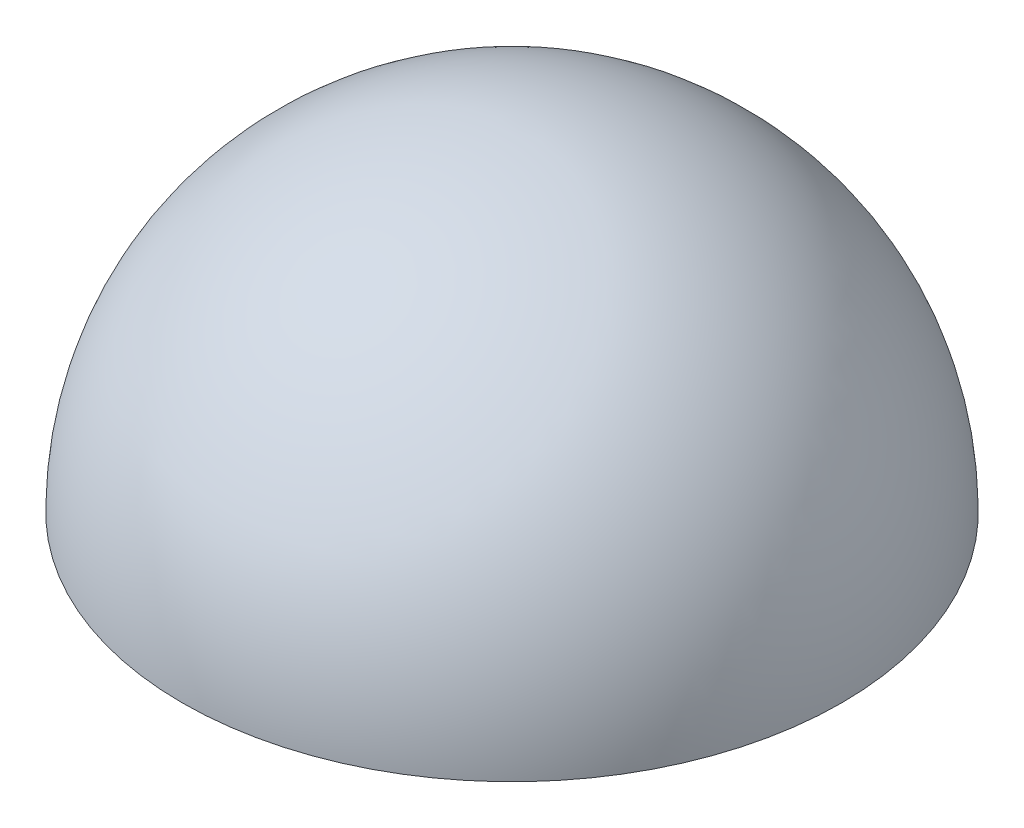
ISO-10303-21;
HEADER;
FILE_DESCRIPTION(('STEP AP214'),'2;1');
FILE_NAME('part.step','',(''),(''),'','','');
FILE_SCHEMA(('AUTOMOTIVE_DESIGN { 1 0 10303 214 1 1 1 1 }'));
ENDSEC;
DATA;
#1=APPLICATION_CONTEXT('core data for automotive mechanical design processes');
#2=APPLICATION_PROTOCOL_DEFINITION('international standard','automotive_design',2000,#1);
#3=PRODUCT_CONTEXT('',#1,'mechanical');
#4=PRODUCT('Part','Part','',(#3));
#5=PRODUCT_RELATED_PRODUCT_CATEGORY('part','',(#4));
#6=PRODUCT_DEFINITION_FORMATION('','',#4);
#7=PRODUCT_DEFINITION_CONTEXT('part definition',#1,'design');
#8=PRODUCT_DEFINITION('design','',#6,#7);
#9=PRODUCT_DEFINITION_SHAPE('','',#8);
#10=(LENGTH_UNIT() NAMED_UNIT(*) SI_UNIT(.MILLI.,.METRE.));
#11=(NAMED_UNIT(*) PLANE_ANGLE_UNIT() SI_UNIT($,.RADIAN.));
#12=(NAMED_UNIT(*) SI_UNIT($,.STERADIAN.) SOLID_ANGLE_UNIT());
#13=UNCERTAINTY_MEASURE_WITH_UNIT(LENGTH_MEASURE(1.E-05),#10,'distance_accuracy_value','');
#14=(GEOMETRIC_REPRESENTATION_CONTEXT(3) GLOBAL_UNCERTAINTY_ASSIGNED_CONTEXT((#13)) GLOBAL_UNIT_ASSIGNED_CONTEXT((#10,
#11,#12)) REPRESENTATION_CONTEXT('',''));
#15=CARTESIAN_POINT('',(0.,0.,0.));
#16=DIRECTION('',(0.,0.,1.));
#17=DIRECTION('',(1.,0.,0.));
#18=AXIS2_PLACEMENT_3D('',#15,#16,#17);
#19=CARTESIAN_POINT('',(0.,0.,0.));
#20=DIRECTION('',(0.,1.,0.));
#21=DIRECTION('',(1.,0.,0.));
#22=AXIS2_PLACEMENT_3D('',#19,#20,#21);
#23=SPHERICAL_SURFACE('',#22,25.4);
#24=CARTESIAN_POINT('',(0.,0.,0.));
#25=DIRECTION('',(0.,1.,0.));
#26=DIRECTION('',(0.,0.,1.));
#27=AXIS2_PLACEMENT_3D('',#24,#25,#26);
#28=CIRCLE('',#27,25.4);
#29=CARTESIAN_POINT('',(0.,0.,25.4));
#30=VERTEX_POINT('',#29);
#31=EDGE_CURVE('E50',#30,#30,#28,.T.);
#32=ORIENTED_EDGE('',*,*,#31,.T.);
#33=EDGE_LOOP('',(#32));
#34=FACE_BOUND('',#33,.T.);
#35=ADVANCED_FACE('F43',(#34),#23,.T.);
#36=CARTESIAN_POINT('',(0.,0.,0.));
#37=DIRECTION('',(0.,1.,0.));
#38=DIRECTION('',(1.,0.,0.));
#39=AXIS2_PLACEMENT_3D('',#36,#37,#38);
#40=SPHERICAL_SURFACE('',#39,22.86);
#41=CARTESIAN_POINT('',(0.,0.,0.));
#42=DIRECTION('',(0.,1.,0.));
#43=DIRECTION('',(0.,0.,1.));
#44=AXIS2_PLACEMENT_3D('',#41,#42,#43);
#45=CIRCLE('',#44,22.86);
#46=CARTESIAN_POINT('',(0.,0.,22.86));
#47=VERTEX_POINT('',#46);
#48=EDGE_CURVE('E10',#47,#47,#45,.T.);
#49=ORIENTED_EDGE('',*,*,#48,.F.);
#50=EDGE_LOOP('',(#49));
#51=FACE_BOUND('',#50,.T.);
#52=ADVANCED_FACE('F60',(#51),#40,.F.);
#53=CARTESIAN_POINT('',(25.4,0.,0.));
#54=DIRECTION('',(0.,1.,0.));
#55=DIRECTION('',(0.,0.,1.));
#56=AXIS2_PLACEMENT_3D('',#53,#54,#55);
#57=PLANE('',#56);
#58=ORIENTED_EDGE('',*,*,#31,.F.);
#59=EDGE_LOOP('',(#58));
#60=FACE_BOUND('',#59,.T.);
#61=ORIENTED_EDGE('',*,*,#48,.T.);
#62=EDGE_LOOP('',(#61));
#63=FACE_BOUND('',#62,.T.);
#64=ADVANCED_FACE('F58',(#60,#63),#57,.F.);
#65=CLOSED_SHELL('',(#35,#52,#64));
#66=MANIFOLD_SOLID_BREP('B2',#65);
#67=ADVANCED_BREP_SHAPE_REPRESENTATION('',(#18,#66),#14);
#68=SHAPE_DEFINITION_REPRESENTATION(#9,#67);
ENDSEC;
END-ISO-10303-21;
